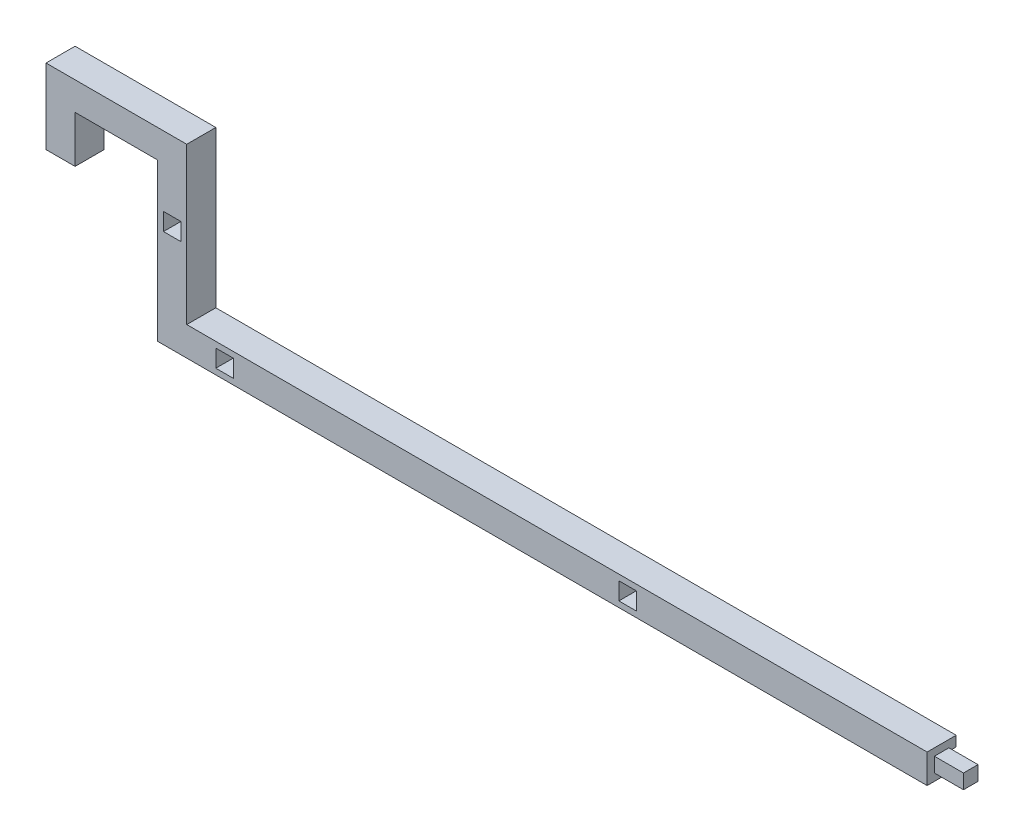
ISO-10303-21;
HEADER;
FILE_DESCRIPTION(('STEP AP214'),'2;1');
FILE_NAME('part.step','',(''),(''),'','','');
FILE_SCHEMA(('AUTOMOTIVE_DESIGN { 1 0 10303 214 1 1 1 1 }'));
ENDSEC;
DATA;
#1=APPLICATION_CONTEXT('core data for automotive mechanical design processes');
#2=APPLICATION_PROTOCOL_DEFINITION('international standard','automotive_design',2000,#1);
#3=PRODUCT_CONTEXT('',#1,'mechanical');
#4=PRODUCT('Part','Part','',(#3));
#5=PRODUCT_RELATED_PRODUCT_CATEGORY('part','',(#4));
#6=PRODUCT_DEFINITION_FORMATION('','',#4);
#7=PRODUCT_DEFINITION_CONTEXT('part definition',#1,'design');
#8=PRODUCT_DEFINITION('design','',#6,#7);
#9=PRODUCT_DEFINITION_SHAPE('','',#8);
#10=(LENGTH_UNIT() NAMED_UNIT(*) SI_UNIT(.MILLI.,.METRE.));
#11=(NAMED_UNIT(*) PLANE_ANGLE_UNIT() SI_UNIT($,.RADIAN.));
#12=(NAMED_UNIT(*) SI_UNIT($,.STERADIAN.) SOLID_ANGLE_UNIT());
#13=UNCERTAINTY_MEASURE_WITH_UNIT(LENGTH_MEASURE(1.E-05),#10,'distance_accuracy_value','');
#14=(GEOMETRIC_REPRESENTATION_CONTEXT(3) GLOBAL_UNCERTAINTY_ASSIGNED_CONTEXT((#13)) GLOBAL_UNIT_ASSIGNED_CONTEXT((#10,
#11,#12)) REPRESENTATION_CONTEXT('',''));
#15=CARTESIAN_POINT('',(0.,0.,0.));
#16=DIRECTION('',(0.,0.,1.));
#17=DIRECTION('',(1.,0.,0.));
#18=AXIS2_PLACEMENT_3D('',#15,#16,#17);
#19=CARTESIAN_POINT('',(0.,0.,0.));
#20=DIRECTION('',(0.,0.,-1.));
#21=DIRECTION('',(-1.,0.,0.));
#22=AXIS2_PLACEMENT_3D('',#19,#20,#21);
#23=PLANE('',#22);
#24=DIRECTION('',(-1.,0.,0.));
#25=VECTOR('',#24,1.);
#26=CARTESIAN_POINT('',(14.2,-17.2,0.));
#27=LINE('',#26,#25);
#28=CARTESIAN_POINT('',(146.5,-17.2,0.));
#29=VERTEX_POINT('',#28);
#30=CARTESIAN_POINT('',(96.4999999999999,-17.2,0.));
#31=VERTEX_POINT('',#30);
#32=EDGE_CURVE('E304',#29,#31,#27,.T.);
#33=ORIENTED_EDGE('',*,*,#32,.F.);
#34=DIRECTION('',(0.,1.,0.));
#35=VECTOR('',#34,1.);
#36=CARTESIAN_POINT('',(146.5,-18.95,0.));
#37=LINE('',#36,#35);
#38=CARTESIAN_POINT('',(146.5,-18.95,0.));
#39=VERTEX_POINT('',#38);
#40=EDGE_CURVE('E503',#39,#29,#37,.T.);
#41=ORIENTED_EDGE('',*,*,#40,.F.);
#42=DIRECTION('',(1.,0.,0.));
#43=VECTOR('',#42,1.);
#44=CARTESIAN_POINT('',(14.2,-18.95,0.));
#45=LINE('',#44,#43);
#46=CARTESIAN_POINT('',(14.2,-18.95,0.));
#47=VERTEX_POINT('',#46);
#48=EDGE_CURVE('E500',#47,#39,#45,.T.);
#49=ORIENTED_EDGE('',*,*,#48,.F.);
#50=DIRECTION('',(0.,-1.,0.));
#51=VECTOR('',#50,1.);
#52=CARTESIAN_POINT('',(14.2,8.05,0.));
#53=LINE('',#52,#51);
#54=CARTESIAN_POINT('',(14.2,-17.2,0.));
#55=VERTEX_POINT('',#54);
#56=EDGE_CURVE('E498',#55,#47,#53,.T.);
#57=ORIENTED_EDGE('',*,*,#56,.F.);
#58=CARTESIAN_POINT('',(24.2,-17.2,0.));
#59=VERTEX_POINT('',#58);
#60=EDGE_CURVE('E589',#59,#55,#27,.T.);
#61=ORIENTED_EDGE('',*,*,#60,.F.);
#62=DIRECTION('',(0.,1.,0.));
#63=VECTOR('',#62,1.);
#64=CARTESIAN_POINT('',(24.2,-14.95,0.));
#65=LINE('',#64,#63);
#66=CARTESIAN_POINT('',(24.2,-17.95,0.));
#67=VERTEX_POINT('',#66);
#68=EDGE_CURVE('E353',#67,#59,#65,.T.);
#69=ORIENTED_EDGE('',*,*,#68,.F.);
#70=DIRECTION('',(-1.,0.,0.));
#71=VECTOR('',#70,1.);
#72=CARTESIAN_POINT('',(27.2,-17.95,0.));
#73=LINE('',#72,#71);
#74=CARTESIAN_POINT('',(27.2,-17.95,0.));
#75=VERTEX_POINT('',#74);
#76=EDGE_CURVE('E348',#75,#67,#73,.T.);
#77=ORIENTED_EDGE('',*,*,#76,.F.);
#78=DIRECTION('',(0.,-1.,0.));
#79=VECTOR('',#78,1.);
#80=CARTESIAN_POINT('',(27.2,-14.95,0.));
#81=LINE('',#80,#79);
#82=CARTESIAN_POINT('',(27.2,-17.2,0.));
#83=VERTEX_POINT('',#82);
#84=EDGE_CURVE('E349',#83,#75,#81,.T.);
#85=ORIENTED_EDGE('',*,*,#84,.F.);
#86=CARTESIAN_POINT('',(93.4999999999999,-17.2,0.));
#87=VERTEX_POINT('',#86);
#88=EDGE_CURVE('E585',#87,#83,#27,.T.);
#89=ORIENTED_EDGE('',*,*,#88,.F.);
#90=DIRECTION('',(0.,1.,0.));
#91=VECTOR('',#90,1.);
#92=CARTESIAN_POINT('',(93.5,-14.95,0.));
#93=LINE('',#92,#91);
#94=CARTESIAN_POINT('',(93.5,-17.95,0.));
#95=VERTEX_POINT('',#94);
#96=EDGE_CURVE('E377',#95,#87,#93,.T.);
#97=ORIENTED_EDGE('',*,*,#96,.F.);
#98=DIRECTION('',(-1.,0.,0.));
#99=VECTOR('',#98,1.);
#100=CARTESIAN_POINT('',(96.5,-17.95,0.));
#101=LINE('',#100,#99);
#102=CARTESIAN_POINT('',(96.5,-17.95,0.));
#103=VERTEX_POINT('',#102);
#104=EDGE_CURVE('E373',#103,#95,#101,.T.);
#105=ORIENTED_EDGE('',*,*,#104,.F.);
#106=DIRECTION('',(0.,-1.,0.));
#107=VECTOR('',#106,1.);
#108=CARTESIAN_POINT('',(96.5,-14.95,0.));
#109=LINE('',#108,#107);
#110=EDGE_CURVE('E344',#31,#103,#109,.T.);
#111=ORIENTED_EDGE('',*,*,#110,.F.);
#112=EDGE_LOOP('',(#33,#41,#49,#57,#61,#69,#77,#85,#89,#97,#105,#111));
#113=FACE_BOUND('',#112,.T.);
#114=ADVANCED_FACE('F32',(#113),#23,.T.);
#115=CARTESIAN_POINT('',(146.5,-18.95,5.));
#116=DIRECTION('',(-1.,0.,0.));
#117=DIRECTION('',(0.,0.,1.));
#118=AXIS2_PLACEMENT_3D('',#115,#116,#117);
#119=PLANE('',#118);
#120=ORIENTED_EDGE('',*,*,#40,.T.);
#121=DIRECTION('',(0.,0.,-1.));
#122=VECTOR('',#121,1.);
#123=CARTESIAN_POINT('',(146.5,-17.2,2.));
#124=LINE('',#123,#122);
#125=CARTESIAN_POINT('',(146.5,-17.2,1.25));
#126=VERTEX_POINT('',#125);
#127=EDGE_CURVE('E600',#126,#29,#124,.T.);
#128=ORIENTED_EDGE('',*,*,#127,.F.);
#129=DIRECTION('',(0.,1.,0.));
#130=VECTOR('',#129,1.);
#131=CARTESIAN_POINT('',(146.5,-17.7,1.25));
#132=LINE('',#131,#130);
#133=CARTESIAN_POINT('',(146.5,-17.7,1.25));
#134=VERTEX_POINT('',#133);
#135=EDGE_CURVE('E454',#134,#126,#132,.T.);
#136=ORIENTED_EDGE('',*,*,#135,.F.);
#137=DIRECTION('',(0.,0.,-1.));
#138=VECTOR('',#137,1.);
#139=CARTESIAN_POINT('',(146.5,-17.7,3.75));
#140=LINE('',#139,#138);
#141=CARTESIAN_POINT('',(146.5,-17.7,3.75));
#142=VERTEX_POINT('',#141);
#143=EDGE_CURVE('E450',#142,#134,#140,.T.);
#144=ORIENTED_EDGE('',*,*,#143,.F.);
#145=DIRECTION('',(0.,-1.,0.));
#146=VECTOR('',#145,1.);
#147=CARTESIAN_POINT('',(146.5,-17.7,3.75));
#148=LINE('',#147,#146);
#149=CARTESIAN_POINT('',(146.5,-15.2,3.75));
#150=VERTEX_POINT('',#149);
#151=EDGE_CURVE('E430',#150,#142,#148,.T.);
#152=ORIENTED_EDGE('',*,*,#151,.F.);
#153=DIRECTION('',(0.,0.,1.));
#154=VECTOR('',#153,1.);
#155=CARTESIAN_POINT('',(146.5,-15.2,3.75));
#156=LINE('',#155,#154);
#157=CARTESIAN_POINT('',(146.5,-15.2,1.25));
#158=VERTEX_POINT('',#157);
#159=EDGE_CURVE('E441',#158,#150,#156,.T.);
#160=ORIENTED_EDGE('',*,*,#159,.F.);
#161=CARTESIAN_POINT('',(146.5,-15.7,1.25));
#162=VERTEX_POINT('',#161);
#163=EDGE_CURVE('E453',#162,#158,#132,.T.);
#164=ORIENTED_EDGE('',*,*,#163,.F.);
#165=DIRECTION('',(0.,0.,-1.));
#166=VECTOR('',#165,1.);
#167=CARTESIAN_POINT('',(146.5,-15.7,2.));
#168=LINE('',#167,#166);
#169=CARTESIAN_POINT('',(146.5,-15.7,0.));
#170=VERTEX_POINT('',#169);
#171=EDGE_CURVE('E311',#162,#170,#168,.T.);
#172=ORIENTED_EDGE('',*,*,#171,.T.);
#173=CARTESIAN_POINT('',(146.5,-13.95,0.));
#174=VERTEX_POINT('',#173);
#175=EDGE_CURVE('E502',#170,#174,#37,.T.);
#176=ORIENTED_EDGE('',*,*,#175,.T.);
#177=DIRECTION('',(0.,0.,-1.));
#178=VECTOR('',#177,1.);
#179=CARTESIAN_POINT('',(146.5,-13.95,5.));
#180=LINE('',#179,#178);
#181=CARTESIAN_POINT('',(146.5,-13.95,5.));
#182=VERTEX_POINT('',#181);
#183=EDGE_CURVE('E531',#182,#174,#180,.T.);
#184=ORIENTED_EDGE('',*,*,#183,.F.);
#185=DIRECTION('',(0.,1.,0.));
#186=VECTOR('',#185,1.);
#187=CARTESIAN_POINT('',(146.5,-18.95,5.));
#188=LINE('',#187,#186);
#189=CARTESIAN_POINT('',(146.5,-18.95,5.));
#190=VERTEX_POINT('',#189);
#191=EDGE_CURVE('E481',#190,#182,#188,.T.);
#192=ORIENTED_EDGE('',*,*,#191,.F.);
#193=DIRECTION('',(0.,0.,-1.));
#194=VECTOR('',#193,1.);
#195=CARTESIAN_POINT('',(146.5,-18.95,5.));
#196=LINE('',#195,#194);
#197=EDGE_CURVE('E534',#190,#39,#196,.T.);
#198=ORIENTED_EDGE('',*,*,#197,.T.);
#199=EDGE_LOOP('',(#120,#128,#136,#144,#152,#160,#164,#172,#176,#184,#192,#198));
#200=FACE_BOUND('',#199,.T.);
#201=ADVANCED_FACE('F614',(#200),#119,.F.);
#202=CARTESIAN_POINT('',(0.,6.7,5.));
#203=DIRECTION('',(-1.,0.,0.));
#204=DIRECTION('',(0.,0.,1.));
#205=AXIS2_PLACEMENT_3D('',#202,#203,#204);
#206=PLANE('',#205);
#207=DIRECTION('',(0.,1.,0.));
#208=VECTOR('',#207,1.);
#209=CARTESIAN_POINT('',(0.,6.7,0.));
#210=LINE('',#209,#208);
#211=CARTESIAN_POINT('',(0.,0.,0.));
#212=VERTEX_POINT('',#211);
#213=CARTESIAN_POINT('',(0.,8.05,0.));
#214=VERTEX_POINT('',#213);
#215=EDGE_CURVE('E471',#212,#214,#210,.T.);
#216=ORIENTED_EDGE('',*,*,#215,.T.);
#217=DIRECTION('',(0.,0.,-1.));
#218=VECTOR('',#217,1.);
#219=CARTESIAN_POINT('',(0.,8.05,5.));
#220=LINE('',#219,#218);
#221=CARTESIAN_POINT('',(0.,8.05,5.));
#222=VERTEX_POINT('',#221);
#223=EDGE_CURVE('E542',#222,#214,#220,.T.);
#224=ORIENTED_EDGE('',*,*,#223,.F.);
#225=DIRECTION('',(0.,1.,0.));
#226=VECTOR('',#225,1.);
#227=CARTESIAN_POINT('',(0.,6.7,5.));
#228=LINE('',#227,#226);
#229=CARTESIAN_POINT('',(0.,0.,5.));
#230=VERTEX_POINT('',#229);
#231=EDGE_CURVE('E472',#230,#222,#228,.T.);
#232=ORIENTED_EDGE('',*,*,#231,.F.);
#233=DIRECTION('',(0.,0.,-1.));
#234=VECTOR('',#233,1.);
#235=CARTESIAN_POINT('',(0.,0.,5.));
#236=LINE('',#235,#234);
#237=EDGE_CURVE('E493',#230,#212,#236,.T.);
#238=ORIENTED_EDGE('',*,*,#237,.T.);
#239=EDGE_LOOP('',(#216,#224,#232,#238));
#240=FACE_BOUND('',#239,.T.);
#241=ADVANCED_FACE('F34',(#240),#206,.F.);
#242=CARTESIAN_POINT('',(5.5,8.05,5.));
#243=DIRECTION('',(0.,1.,0.));
#244=DIRECTION('',(0.,0.,1.));
#245=AXIS2_PLACEMENT_3D('',#242,#243,#244);
#246=PLANE('',#245);
#247=DIRECTION('',(1.,0.,0.));
#248=VECTOR('',#247,1.);
#249=CARTESIAN_POINT('',(5.5,8.05,0.));
#250=LINE('',#249,#248);
#251=CARTESIAN_POINT('',(14.2,8.05,0.));
#252=VERTEX_POINT('',#251);
#253=EDGE_CURVE('E496',#214,#252,#250,.T.);
#254=ORIENTED_EDGE('',*,*,#253,.T.);
#255=DIRECTION('',(0.,0.,-1.));
#256=VECTOR('',#255,1.);
#257=CARTESIAN_POINT('',(14.2,8.05,5.));
#258=LINE('',#257,#256);
#259=CARTESIAN_POINT('',(14.2,8.05,5.));
#260=VERTEX_POINT('',#259);
#261=EDGE_CURVE('E540',#260,#252,#258,.T.);
#262=ORIENTED_EDGE('',*,*,#261,.F.);
#263=DIRECTION('',(1.,0.,0.));
#264=VECTOR('',#263,1.);
#265=CARTESIAN_POINT('',(0.,8.05,5.));
#266=LINE('',#265,#264);
#267=EDGE_CURVE('E474',#222,#260,#266,.T.);
#268=ORIENTED_EDGE('',*,*,#267,.F.);
#269=ORIENTED_EDGE('',*,*,#223,.T.);
#270=EDGE_LOOP('',(#254,#262,#268,#269));
#271=FACE_BOUND('',#270,.T.);
#272=ADVANCED_FACE('F949',(#271),#246,.F.);
#273=CARTESIAN_POINT('',(14.2,8.05,5.));
#274=DIRECTION('',(1.,0.,0.));
#275=DIRECTION('',(0.,1.,0.));
#276=AXIS2_PLACEMENT_3D('',#273,#274,#275);
#277=PLANE('',#276);
#278=DIRECTION('',(0.,1.,0.));
#279=VECTOR('',#278,1.);
#280=CARTESIAN_POINT('',(14.2,-17.2,2.));
#281=LINE('',#280,#279);
#282=CARTESIAN_POINT('',(14.2,-17.2,2.));
#283=VERTEX_POINT('',#282);
#284=CARTESIAN_POINT('',(14.2,-15.7,2.));
#285=VERTEX_POINT('',#284);
#286=EDGE_CURVE('E297',#283,#285,#281,.T.);
#287=ORIENTED_EDGE('',*,*,#286,.F.);
#288=DIRECTION('',(0.,0.,-1.));
#289=VECTOR('',#288,1.);
#290=CARTESIAN_POINT('',(14.2,-17.2,2.));
#291=LINE('',#290,#289);
#292=EDGE_CURVE('E322',#283,#55,#291,.T.);
#293=ORIENTED_EDGE('',*,*,#292,.T.);
#294=ORIENTED_EDGE('',*,*,#56,.T.);
#295=DIRECTION('',(0.,0.,-1.));
#296=VECTOR('',#295,1.);
#297=CARTESIAN_POINT('',(14.2,-18.95,5.));
#298=LINE('',#297,#296);
#299=CARTESIAN_POINT('',(14.2,-18.95,5.));
#300=VERTEX_POINT('',#299);
#301=EDGE_CURVE('E537',#300,#47,#298,.T.);
#302=ORIENTED_EDGE('',*,*,#301,.F.);
#303=DIRECTION('',(0.,-1.,0.));
#304=VECTOR('',#303,1.);
#305=CARTESIAN_POINT('',(14.2,8.05,5.));
#306=LINE('',#305,#304);
#307=EDGE_CURVE('E477',#260,#300,#306,.T.);
#308=ORIENTED_EDGE('',*,*,#307,.F.);
#309=ORIENTED_EDGE('',*,*,#261,.T.);
#310=CARTESIAN_POINT('',(14.2,-15.7,0.));
#311=VERTEX_POINT('',#310);
#312=EDGE_CURVE('E310',#252,#311,#53,.T.);
#313=ORIENTED_EDGE('',*,*,#312,.T.);
#314=DIRECTION('',(0.,0.,-1.));
#315=VECTOR('',#314,1.);
#316=CARTESIAN_POINT('',(14.2,-15.7,2.));
#317=LINE('',#316,#315);
#318=EDGE_CURVE('E287',#285,#311,#317,.T.);
#319=ORIENTED_EDGE('',*,*,#318,.F.);
#320=EDGE_LOOP('',(#287,#293,#294,#302,#308,#309,#313,#319));
#321=FACE_BOUND('',#320,.T.);
#322=ADVANCED_FACE('F307',(#321),#277,.F.);
#323=CARTESIAN_POINT('',(14.2,-18.95,5.));
#324=DIRECTION('',(0.,1.,0.));
#325=DIRECTION('',(-1.,0.,0.));
#326=AXIS2_PLACEMENT_3D('',#323,#324,#325);
#327=PLANE('',#326);
#328=ORIENTED_EDGE('',*,*,#48,.T.);
#329=ORIENTED_EDGE('',*,*,#197,.F.);
#330=DIRECTION('',(1.,0.,0.));
#331=VECTOR('',#330,1.);
#332=CARTESIAN_POINT('',(14.2,-18.95,5.));
#333=LINE('',#332,#331);
#334=EDGE_CURVE('E479',#300,#190,#333,.T.);
#335=ORIENTED_EDGE('',*,*,#334,.F.);
#336=ORIENTED_EDGE('',*,*,#301,.T.);
#337=EDGE_LOOP('',(#328,#329,#335,#336));
#338=FACE_BOUND('',#337,.T.);
#339=ADVANCED_FACE('F932',(#338),#327,.F.);
#340=CARTESIAN_POINT('',(19.2,-13.95,5.));
#341=DIRECTION('',(0.,-1.,0.));
#342=DIRECTION('',(0.,0.,-1.));
#343=AXIS2_PLACEMENT_3D('',#340,#341,#342);
#344=PLANE('',#343);
#345=DIRECTION('',(-1.,0.,0.));
#346=VECTOR('',#345,1.);
#347=CARTESIAN_POINT('',(19.2,-13.95,0.));
#348=LINE('',#347,#346);
#349=CARTESIAN_POINT('',(19.2,-13.95,0.));
#350=VERTEX_POINT('',#349);
#351=EDGE_CURVE('E506',#174,#350,#348,.T.);
#352=ORIENTED_EDGE('',*,*,#351,.T.);
#353=DIRECTION('',(0.,0.,-1.));
#354=VECTOR('',#353,1.);
#355=CARTESIAN_POINT('',(19.2,-13.95,5.));
#356=LINE('',#355,#354);
#357=CARTESIAN_POINT('',(19.2,-13.95,5.));
#358=VERTEX_POINT('',#357);
#359=EDGE_CURVE('E528',#358,#350,#356,.T.);
#360=ORIENTED_EDGE('',*,*,#359,.F.);
#361=DIRECTION('',(-1.,0.,0.));
#362=VECTOR('',#361,1.);
#363=CARTESIAN_POINT('',(19.2,-13.95,5.));
#364=LINE('',#363,#362);
#365=EDGE_CURVE('E483',#182,#358,#364,.T.);
#366=ORIENTED_EDGE('',*,*,#365,.F.);
#367=ORIENTED_EDGE('',*,*,#183,.T.);
#368=EDGE_LOOP('',(#352,#360,#366,#367));
#369=FACE_BOUND('',#368,.T.);
#370=ADVANCED_FACE('F922',(#369),#344,.F.);
#371=CARTESIAN_POINT('',(19.2,12.9,5.));
#372=DIRECTION('',(-1.,0.,0.));
#373=DIRECTION('',(0.,-1.,0.));
#374=AXIS2_PLACEMENT_3D('',#371,#372,#373);
#375=PLANE('',#374);
#376=DIRECTION('',(0.,1.,0.));
#377=VECTOR('',#376,1.);
#378=CARTESIAN_POINT('',(19.2,12.9,0.));
#379=LINE('',#378,#377);
#380=CARTESIAN_POINT('',(19.2,12.9,0.));
#381=VERTEX_POINT('',#380);
#382=EDGE_CURVE('E508',#350,#381,#379,.T.);
#383=ORIENTED_EDGE('',*,*,#382,.T.);
#384=DIRECTION('',(0.,0.,-1.));
#385=VECTOR('',#384,1.);
#386=CARTESIAN_POINT('',(19.2,12.9,5.));
#387=LINE('',#386,#385);
#388=CARTESIAN_POINT('',(19.2,12.9,5.));
#389=VERTEX_POINT('',#388);
#390=EDGE_CURVE('E525',#389,#381,#387,.T.);
#391=ORIENTED_EDGE('',*,*,#390,.F.);
#392=DIRECTION('',(0.,1.,0.));
#393=VECTOR('',#392,1.);
#394=CARTESIAN_POINT('',(19.2,12.9,5.));
#395=LINE('',#394,#393);
#396=EDGE_CURVE('E485',#358,#389,#395,.T.);
#397=ORIENTED_EDGE('',*,*,#396,.F.);
#398=ORIENTED_EDGE('',*,*,#359,.T.);
#399=EDGE_LOOP('',(#383,#391,#397,#398));
#400=FACE_BOUND('',#399,.T.);
#401=ADVANCED_FACE('F911',(#400),#375,.F.);
#402=CARTESIAN_POINT('',(-5.,12.9,5.));
#403=DIRECTION('',(0.,-1.,0.));
#404=DIRECTION('',(0.,0.,-1.));
#405=AXIS2_PLACEMENT_3D('',#402,#403,#404);
#406=PLANE('',#405);
#407=DIRECTION('',(-1.,0.,0.));
#408=VECTOR('',#407,1.);
#409=CARTESIAN_POINT('',(-5.,12.9,0.));
#410=LINE('',#409,#408);
#411=CARTESIAN_POINT('',(-5.,12.9,0.));
#412=VERTEX_POINT('',#411);
#413=EDGE_CURVE('E511',#381,#412,#410,.T.);
#414=ORIENTED_EDGE('',*,*,#413,.T.);
#415=DIRECTION('',(0.,0.,-1.));
#416=VECTOR('',#415,1.);
#417=CARTESIAN_POINT('',(-5.,12.9,5.));
#418=LINE('',#417,#416);
#419=CARTESIAN_POINT('',(-5.,12.9,5.));
#420=VERTEX_POINT('',#419);
#421=EDGE_CURVE('E522',#420,#412,#418,.T.);
#422=ORIENTED_EDGE('',*,*,#421,.F.);
#423=DIRECTION('',(-1.,0.,0.));
#424=VECTOR('',#423,1.);
#425=CARTESIAN_POINT('',(5.5,12.9,5.));
#426=LINE('',#425,#424);
#427=EDGE_CURVE('E487',#389,#420,#426,.T.);
#428=ORIENTED_EDGE('',*,*,#427,.F.);
#429=ORIENTED_EDGE('',*,*,#390,.T.);
#430=EDGE_LOOP('',(#414,#422,#428,#429));
#431=FACE_BOUND('',#430,.T.);
#432=ADVANCED_FACE('F901',(#431),#406,.F.);
#433=CARTESIAN_POINT('',(-5.,0.,5.));
#434=DIRECTION('',(1.,0.,0.));
#435=DIRECTION('',(0.,0.,-1.));
#436=AXIS2_PLACEMENT_3D('',#433,#434,#435);
#437=PLANE('',#436);
#438=DIRECTION('',(0.,-1.,0.));
#439=VECTOR('',#438,1.);
#440=CARTESIAN_POINT('',(-5.,0.,0.));
#441=LINE('',#440,#439);
#442=CARTESIAN_POINT('',(-5.,0.,0.));
#443=VERTEX_POINT('',#442);
#444=EDGE_CURVE('E513',#412,#443,#441,.T.);
#445=ORIENTED_EDGE('',*,*,#444,.T.);
#446=DIRECTION('',(0.,0.,-1.));
#447=VECTOR('',#446,1.);
#448=CARTESIAN_POINT('',(-5.,0.,5.));
#449=LINE('',#448,#447);
#450=CARTESIAN_POINT('',(-5.,0.,5.));
#451=VERTEX_POINT('',#450);
#452=EDGE_CURVE('E519',#451,#443,#449,.T.);
#453=ORIENTED_EDGE('',*,*,#452,.F.);
#454=DIRECTION('',(0.,-1.,0.));
#455=VECTOR('',#454,1.);
#456=CARTESIAN_POINT('',(-5.,0.,5.));
#457=LINE('',#456,#455);
#458=EDGE_CURVE('E489',#420,#451,#457,.T.);
#459=ORIENTED_EDGE('',*,*,#458,.F.);
#460=ORIENTED_EDGE('',*,*,#421,.T.);
#461=EDGE_LOOP('',(#445,#453,#459,#460));
#462=FACE_BOUND('',#461,.T.);
#463=ADVANCED_FACE('F667',(#462),#437,.F.);
#464=CARTESIAN_POINT('',(0.,0.,5.));
#465=DIRECTION('',(0.,1.,0.));
#466=DIRECTION('',(-1.,0.,0.));
#467=AXIS2_PLACEMENT_3D('',#464,#465,#466);
#468=PLANE('',#467);
#469=DIRECTION('',(1.,0.,0.));
#470=VECTOR('',#469,1.);
#471=CARTESIAN_POINT('',(0.,0.,0.));
#472=LINE('',#471,#470);
#473=EDGE_CURVE('E475',#443,#212,#472,.T.);
#474=ORIENTED_EDGE('',*,*,#473,.T.);
#475=ORIENTED_EDGE('',*,*,#237,.F.);
#476=DIRECTION('',(1.,0.,0.));
#477=VECTOR('',#476,1.);
#478=CARTESIAN_POINT('',(0.,0.,5.));
#479=LINE('',#478,#477);
#480=EDGE_CURVE('E491',#451,#230,#479,.T.);
#481=ORIENTED_EDGE('',*,*,#480,.F.);
#482=ORIENTED_EDGE('',*,*,#452,.T.);
#483=EDGE_LOOP('',(#474,#475,#481,#482));
#484=FACE_BOUND('',#483,.T.);
#485=ADVANCED_FACE('F661',(#484),#468,.F.);
#486=CARTESIAN_POINT('',(0.,0.,5.));
#487=DIRECTION('',(0.,0.,-1.));
#488=DIRECTION('',(-1.,0.,0.));
#489=AXIS2_PLACEMENT_3D('',#486,#487,#488);
#490=PLANE('',#489);
#491=DIRECTION('',(1.,0.,0.));
#492=VECTOR('',#491,1.);
#493=CARTESIAN_POINT('',(0.,-14.95,5.));
#494=LINE('',#493,#492);
#495=CARTESIAN_POINT('',(24.2,-14.95,5.));
#496=VERTEX_POINT('',#495);
#497=CARTESIAN_POINT('',(27.2,-14.95,5.));
#498=VERTEX_POINT('',#497);
#499=EDGE_CURVE('E410',#496,#498,#494,.T.);
#500=ORIENTED_EDGE('',*,*,#499,.T.);
#501=DIRECTION('',(0.,-1.,0.));
#502=VECTOR('',#501,1.);
#503=CARTESIAN_POINT('',(27.2,0.,5.));
#504=LINE('',#503,#502);
#505=CARTESIAN_POINT('',(27.2,-17.95,5.));
#506=VERTEX_POINT('',#505);
#507=EDGE_CURVE('E413',#498,#506,#504,.T.);
#508=ORIENTED_EDGE('',*,*,#507,.T.);
#509=DIRECTION('',(-1.,0.,0.));
#510=VECTOR('',#509,1.);
#511=CARTESIAN_POINT('',(0.,-17.95,5.));
#512=LINE('',#511,#510);
#513=CARTESIAN_POINT('',(24.2,-17.95,5.));
#514=VERTEX_POINT('',#513);
#515=EDGE_CURVE('E404',#506,#514,#512,.T.);
#516=ORIENTED_EDGE('',*,*,#515,.T.);
#517=DIRECTION('',(0.,1.,0.));
#518=VECTOR('',#517,1.);
#519=CARTESIAN_POINT('',(24.2,0.,5.));
#520=LINE('',#519,#518);
#521=EDGE_CURVE('E407',#514,#496,#520,.T.);
#522=ORIENTED_EDGE('',*,*,#521,.T.);
#523=EDGE_LOOP('',(#500,#508,#516,#522));
#524=FACE_BOUND('',#523,.T.);
#525=DIRECTION('',(1.,0.,0.));
#526=VECTOR('',#525,1.);
#527=CARTESIAN_POINT('',(0.,-14.95,5.));
#528=LINE('',#527,#526);
#529=CARTESIAN_POINT('',(93.5,-14.95,5.));
#530=VERTEX_POINT('',#529);
#531=CARTESIAN_POINT('',(96.5,-14.95,5.));
#532=VERTEX_POINT('',#531);
#533=EDGE_CURVE('E398',#530,#532,#528,.T.);
#534=ORIENTED_EDGE('',*,*,#533,.T.);
#535=DIRECTION('',(0.,-1.,0.));
#536=VECTOR('',#535,1.);
#537=CARTESIAN_POINT('',(96.5,0.,5.));
#538=LINE('',#537,#536);
#539=CARTESIAN_POINT('',(96.5,-17.95,5.));
#540=VERTEX_POINT('',#539);
#541=EDGE_CURVE('E401',#532,#540,#538,.T.);
#542=ORIENTED_EDGE('',*,*,#541,.T.);
#543=DIRECTION('',(-1.,0.,0.));
#544=VECTOR('',#543,1.);
#545=CARTESIAN_POINT('',(0.,-17.95,5.));
#546=LINE('',#545,#544);
#547=CARTESIAN_POINT('',(93.5,-17.95,5.));
#548=VERTEX_POINT('',#547);
#549=EDGE_CURVE('E362',#540,#548,#546,.T.);
#550=ORIENTED_EDGE('',*,*,#549,.T.);
#551=DIRECTION('',(0.,1.,0.));
#552=VECTOR('',#551,1.);
#553=CARTESIAN_POINT('',(93.5,0.,5.));
#554=LINE('',#553,#552);
#555=EDGE_CURVE('E395',#548,#530,#554,.T.);
#556=ORIENTED_EDGE('',*,*,#555,.T.);
#557=EDGE_LOOP('',(#534,#542,#550,#556));
#558=FACE_BOUND('',#557,.T.);
#559=DIRECTION('',(1.,0.,0.));
#560=VECTOR('',#559,1.);
#561=CARTESIAN_POINT('',(15.2,-2.1,5.));
#562=LINE('',#561,#560);
#563=CARTESIAN_POINT('',(15.2,-2.1,5.));
#564=VERTEX_POINT('',#563);
#565=CARTESIAN_POINT('',(18.2,-2.1,5.));
#566=VERTEX_POINT('',#565);
#567=EDGE_CURVE('E418',#564,#566,#562,.T.);
#568=ORIENTED_EDGE('',*,*,#567,.F.);
#569=DIRECTION('',(0.,-1.,0.));
#570=VECTOR('',#569,1.);
#571=CARTESIAN_POINT('',(15.2,0.9,5.));
#572=LINE('',#571,#570);
#573=CARTESIAN_POINT('',(15.2,0.9,5.));
#574=VERTEX_POINT('',#573);
#575=EDGE_CURVE('E416',#574,#564,#572,.T.);
#576=ORIENTED_EDGE('',*,*,#575,.F.);
#577=DIRECTION('',(-1.,0.,0.));
#578=VECTOR('',#577,1.);
#579=CARTESIAN_POINT('',(15.2,0.9,5.));
#580=LINE('',#579,#578);
#581=CARTESIAN_POINT('',(18.2,0.9,5.));
#582=VERTEX_POINT('',#581);
#583=EDGE_CURVE('E424',#582,#574,#580,.T.);
#584=ORIENTED_EDGE('',*,*,#583,.F.);
#585=DIRECTION('',(0.,1.,0.));
#586=VECTOR('',#585,1.);
#587=CARTESIAN_POINT('',(18.2,0.9,5.));
#588=LINE('',#587,#586);
#589=EDGE_CURVE('E421',#566,#582,#588,.T.);
#590=ORIENTED_EDGE('',*,*,#589,.F.);
#591=EDGE_LOOP('',(#568,#576,#584,#590));
#592=FACE_BOUND('',#591,.T.);
#593=ORIENTED_EDGE('',*,*,#231,.T.);
#594=ORIENTED_EDGE('',*,*,#267,.T.);
#595=ORIENTED_EDGE('',*,*,#307,.T.);
#596=ORIENTED_EDGE('',*,*,#334,.T.);
#597=ORIENTED_EDGE('',*,*,#191,.T.);
#598=ORIENTED_EDGE('',*,*,#365,.T.);
#599=ORIENTED_EDGE('',*,*,#396,.T.);
#600=ORIENTED_EDGE('',*,*,#427,.T.);
#601=ORIENTED_EDGE('',*,*,#458,.T.);
#602=ORIENTED_EDGE('',*,*,#480,.T.);
#603=EDGE_LOOP('',(#593,#594,#595,#596,#597,#598,#599,#600,#601,#602));
#604=FACE_BOUND('',#603,.T.);
#605=ADVANCED_FACE('F571',(#524,#558,#592,#604),#490,.F.);
#606=DIRECTION('',(1.,0.,0.));
#607=VECTOR('',#606,1.);
#608=CARTESIAN_POINT('',(14.2,-15.7,0.));
#609=LINE('',#608,#607);
#610=CARTESIAN_POINT('',(24.2,-15.7,0.));
#611=VERTEX_POINT('',#610);
#612=EDGE_CURVE('E563',#311,#611,#609,.T.);
#613=ORIENTED_EDGE('',*,*,#612,.F.);
#614=ORIENTED_EDGE('',*,*,#312,.F.);
#615=ORIENTED_EDGE('',*,*,#253,.F.);
#616=ORIENTED_EDGE('',*,*,#215,.F.);
#617=ORIENTED_EDGE('',*,*,#473,.F.);
#618=ORIENTED_EDGE('',*,*,#444,.F.);
#619=ORIENTED_EDGE('',*,*,#413,.F.);
#620=ORIENTED_EDGE('',*,*,#382,.F.);
#621=ORIENTED_EDGE('',*,*,#351,.F.);
#622=ORIENTED_EDGE('',*,*,#175,.F.);
#623=CARTESIAN_POINT('',(96.4999999999999,-15.7,0.));
#624=VERTEX_POINT('',#623);
#625=EDGE_CURVE('E596',#624,#170,#609,.T.);
#626=ORIENTED_EDGE('',*,*,#625,.F.);
#627=CARTESIAN_POINT('',(96.5,-14.95,0.));
#628=VERTEX_POINT('',#627);
#629=EDGE_CURVE('E370',#628,#624,#109,.T.);
#630=ORIENTED_EDGE('',*,*,#629,.F.);
#631=DIRECTION('',(1.,0.,0.));
#632=VECTOR('',#631,1.);
#633=CARTESIAN_POINT('',(96.5,-14.95,0.));
#634=LINE('',#633,#632);
#635=CARTESIAN_POINT('',(93.5,-14.95,0.));
#636=VERTEX_POINT('',#635);
#637=EDGE_CURVE('E380',#636,#628,#634,.T.);
#638=ORIENTED_EDGE('',*,*,#637,.F.);
#639=CARTESIAN_POINT('',(93.4999999999999,-15.7,0.));
#640=VERTEX_POINT('',#639);
#641=EDGE_CURVE('E376',#640,#636,#93,.T.);
#642=ORIENTED_EDGE('',*,*,#641,.F.);
#643=CARTESIAN_POINT('',(27.2,-15.7,0.));
#644=VERTEX_POINT('',#643);
#645=EDGE_CURVE('E595',#644,#640,#609,.T.);
#646=ORIENTED_EDGE('',*,*,#645,.F.);
#647=CARTESIAN_POINT('',(27.2,-14.95,0.));
#648=VERTEX_POINT('',#647);
#649=EDGE_CURVE('E345',#648,#644,#81,.T.);
#650=ORIENTED_EDGE('',*,*,#649,.F.);
#651=DIRECTION('',(1.,0.,0.));
#652=VECTOR('',#651,1.);
#653=CARTESIAN_POINT('',(27.2,-14.95,0.));
#654=LINE('',#653,#652);
#655=CARTESIAN_POINT('',(24.2,-14.95,0.));
#656=VERTEX_POINT('',#655);
#657=EDGE_CURVE('E356',#656,#648,#654,.T.);
#658=ORIENTED_EDGE('',*,*,#657,.F.);
#659=EDGE_CURVE('E352',#611,#656,#65,.T.);
#660=ORIENTED_EDGE('',*,*,#659,.F.);
#661=EDGE_LOOP('',(#613,#614,#615,#616,#617,#618,#619,#620,#621,#622,#626,#630,#638,#642,#646,
#650,#658,#660));
#662=FACE_BOUND('',#661,.T.);
#663=DIRECTION('',(0.,1.,0.));
#664=VECTOR('',#663,1.);
#665=CARTESIAN_POINT('',(15.2,0.,0.));
#666=LINE('',#665,#664);
#667=CARTESIAN_POINT('',(15.2,-2.1,0.));
#668=VERTEX_POINT('',#667);
#669=CARTESIAN_POINT('',(15.2,0.9,0.));
#670=VERTEX_POINT('',#669);
#671=EDGE_CURVE('E552',#668,#670,#666,.T.);
#672=ORIENTED_EDGE('',*,*,#671,.F.);
#673=DIRECTION('',(-1.,0.,0.));
#674=VECTOR('',#673,1.);
#675=CARTESIAN_POINT('',(0.,-2.1,0.));
#676=LINE('',#675,#674);
#677=CARTESIAN_POINT('',(18.2,-2.1,0.));
#678=VERTEX_POINT('',#677);
#679=EDGE_CURVE('E545',#678,#668,#676,.T.);
#680=ORIENTED_EDGE('',*,*,#679,.F.);
#681=DIRECTION('',(0.,-1.,0.));
#682=VECTOR('',#681,1.);
#683=CARTESIAN_POINT('',(18.2,0.,0.));
#684=LINE('',#683,#682);
#685=CARTESIAN_POINT('',(18.2,0.9,0.));
#686=VERTEX_POINT('',#685);
#687=EDGE_CURVE('E547',#686,#678,#684,.T.);
#688=ORIENTED_EDGE('',*,*,#687,.F.);
#689=DIRECTION('',(1.,0.,0.));
#690=VECTOR('',#689,1.);
#691=CARTESIAN_POINT('',(0.,0.9,0.));
#692=LINE('',#691,#690);
#693=EDGE_CURVE('E550',#670,#686,#692,.T.);
#694=ORIENTED_EDGE('',*,*,#693,.F.);
#695=EDGE_LOOP('',(#672,#680,#688,#694));
#696=FACE_BOUND('',#695,.T.);
#697=ADVANCED_FACE('F561',(#662,#696),#23,.T.);
#698=CARTESIAN_POINT('',(151.5,-17.7,3.75));
#699=DIRECTION('',(0.,0.,-1.));
#700=DIRECTION('',(-1.,0.,0.));
#701=AXIS2_PLACEMENT_3D('',#698,#699,#700);
#702=PLANE('',#701);
#703=ORIENTED_EDGE('',*,*,#151,.T.);
#704=DIRECTION('',(-1.,0.,0.));
#705=VECTOR('',#704,1.);
#706=CARTESIAN_POINT('',(151.5,-17.7,3.75));
#707=LINE('',#706,#705);
#708=CARTESIAN_POINT('',(151.5,-17.7,3.75));
#709=VERTEX_POINT('',#708);
#710=EDGE_CURVE('E468',#709,#142,#707,.T.);
#711=ORIENTED_EDGE('',*,*,#710,.F.);
#712=DIRECTION('',(0.,-1.,0.));
#713=VECTOR('',#712,1.);
#714=CARTESIAN_POINT('',(151.5,-17.7,3.75));
#715=LINE('',#714,#713);
#716=CARTESIAN_POINT('',(151.5,-15.2,3.75));
#717=VERTEX_POINT('',#716);
#718=EDGE_CURVE('E437',#717,#709,#715,.T.);
#719=ORIENTED_EDGE('',*,*,#718,.F.);
#720=DIRECTION('',(-1.,0.,0.));
#721=VECTOR('',#720,1.);
#722=CARTESIAN_POINT('',(151.5,-15.2,3.75));
#723=LINE('',#722,#721);
#724=EDGE_CURVE('E447',#717,#150,#723,.T.);
#725=ORIENTED_EDGE('',*,*,#724,.T.);
#726=EDGE_LOOP('',(#703,#711,#719,#725));
#727=FACE_BOUND('',#726,.T.);
#728=ADVANCED_FACE('F626',(#727),#702,.F.);
#729=CARTESIAN_POINT('',(151.5,-17.7,3.75));
#730=DIRECTION('',(0.,1.,0.));
#731=DIRECTION('',(0.,0.,1.));
#732=AXIS2_PLACEMENT_3D('',#729,#730,#731);
#733=PLANE('',#732);
#734=ORIENTED_EDGE('',*,*,#143,.T.);
#735=DIRECTION('',(-1.,0.,0.));
#736=VECTOR('',#735,1.);
#737=CARTESIAN_POINT('',(151.5,-17.7,1.25));
#738=LINE('',#737,#736);
#739=CARTESIAN_POINT('',(151.5,-17.7,1.25));
#740=VERTEX_POINT('',#739);
#741=EDGE_CURVE('E465',#740,#134,#738,.T.);
#742=ORIENTED_EDGE('',*,*,#741,.F.);
#743=DIRECTION('',(0.,0.,-1.));
#744=VECTOR('',#743,1.);
#745=CARTESIAN_POINT('',(151.5,-17.7,3.75));
#746=LINE('',#745,#744);
#747=EDGE_CURVE('E440',#709,#740,#746,.T.);
#748=ORIENTED_EDGE('',*,*,#747,.F.);
#749=ORIENTED_EDGE('',*,*,#710,.T.);
#750=EDGE_LOOP('',(#734,#742,#748,#749));
#751=FACE_BOUND('',#750,.T.);
#752=ADVANCED_FACE('F622',(#751),#733,.F.);
#753=CARTESIAN_POINT('',(151.5,-17.7,1.25));
#754=DIRECTION('',(0.,0.,1.));
#755=DIRECTION('',(1.,0.,0.));
#756=AXIS2_PLACEMENT_3D('',#753,#754,#755);
#757=PLANE('',#756);
#758=ORIENTED_EDGE('',*,*,#135,.T.);
#759=EDGE_CURVE('E457',#126,#162,#132,.T.);
#760=ORIENTED_EDGE('',*,*,#759,.T.);
#761=ORIENTED_EDGE('',*,*,#163,.T.);
#762=DIRECTION('',(-1.,0.,0.));
#763=VECTOR('',#762,1.);
#764=CARTESIAN_POINT('',(151.5,-15.2,1.25));
#765=LINE('',#764,#763);
#766=CARTESIAN_POINT('',(151.5,-15.2,1.25));
#767=VERTEX_POINT('',#766);
#768=EDGE_CURVE('E462',#767,#158,#765,.T.);
#769=ORIENTED_EDGE('',*,*,#768,.F.);
#770=DIRECTION('',(0.,1.,0.));
#771=VECTOR('',#770,1.);
#772=CARTESIAN_POINT('',(151.5,-17.7,1.25));
#773=LINE('',#772,#771);
#774=EDGE_CURVE('E443',#740,#767,#773,.T.);
#775=ORIENTED_EDGE('',*,*,#774,.F.);
#776=ORIENTED_EDGE('',*,*,#741,.T.);
#777=EDGE_LOOP('',(#758,#760,#761,#769,#775,#776));
#778=FACE_BOUND('',#777,.T.);
#779=ADVANCED_FACE('F618',(#778),#757,.F.);
#780=CARTESIAN_POINT('',(151.5,-15.2,3.75));
#781=DIRECTION('',(0.,-1.,0.));
#782=DIRECTION('',(0.,0.,-1.));
#783=AXIS2_PLACEMENT_3D('',#780,#781,#782);
#784=PLANE('',#783);
#785=ORIENTED_EDGE('',*,*,#159,.T.);
#786=ORIENTED_EDGE('',*,*,#724,.F.);
#787=DIRECTION('',(0.,0.,1.));
#788=VECTOR('',#787,1.);
#789=CARTESIAN_POINT('',(151.5,-15.2,3.75));
#790=LINE('',#789,#788);
#791=EDGE_CURVE('E445',#767,#717,#790,.T.);
#792=ORIENTED_EDGE('',*,*,#791,.F.);
#793=ORIENTED_EDGE('',*,*,#768,.T.);
#794=EDGE_LOOP('',(#785,#786,#792,#793));
#795=FACE_BOUND('',#794,.T.);
#796=ADVANCED_FACE('F629',(#795),#784,.F.);
#797=CARTESIAN_POINT('',(151.5,0.,0.));
#798=DIRECTION('',(-1.,0.,0.));
#799=DIRECTION('',(0.,0.,1.));
#800=AXIS2_PLACEMENT_3D('',#797,#798,#799);
#801=PLANE('',#800);
#802=ORIENTED_EDGE('',*,*,#718,.T.);
#803=ORIENTED_EDGE('',*,*,#747,.T.);
#804=ORIENTED_EDGE('',*,*,#774,.T.);
#805=ORIENTED_EDGE('',*,*,#791,.T.);
#806=EDGE_LOOP('',(#802,#803,#804,#805));
#807=FACE_BOUND('',#806,.T.);
#808=ADVANCED_FACE('F632',(#807),#801,.F.);
#809=CARTESIAN_POINT('',(15.2,0.9,-5.));
#810=DIRECTION('',(-1.,0.,0.));
#811=DIRECTION('',(0.,0.,1.));
#812=AXIS2_PLACEMENT_3D('',#809,#810,#811);
#813=PLANE('',#812);
#814=ORIENTED_EDGE('',*,*,#671,.T.);
#815=DIRECTION('',(0.,0.,1.));
#816=VECTOR('',#815,1.);
#817=CARTESIAN_POINT('',(15.2,0.9,-5.));
#818=LINE('',#817,#816);
#819=EDGE_CURVE('E428',#670,#574,#818,.T.);
#820=ORIENTED_EDGE('',*,*,#819,.T.);
#821=ORIENTED_EDGE('',*,*,#575,.T.);
#822=DIRECTION('',(0.,0.,1.));
#823=VECTOR('',#822,1.);
#824=CARTESIAN_POINT('',(15.2,-2.1,-5.));
#825=LINE('',#824,#823);
#826=EDGE_CURVE('E427',#668,#564,#825,.T.);
#827=ORIENTED_EDGE('',*,*,#826,.F.);
#828=EDGE_LOOP('',(#814,#820,#821,#827));
#829=FACE_BOUND('',#828,.T.);
#830=ADVANCED_FACE('F634',(#829),#813,.F.);
#831=CARTESIAN_POINT('',(15.2,0.9,-5.));
#832=DIRECTION('',(0.,1.,0.));
#833=DIRECTION('',(0.,0.,1.));
#834=AXIS2_PLACEMENT_3D('',#831,#832,#833);
#835=PLANE('',#834);
#836=ORIENTED_EDGE('',*,*,#693,.T.);
#837=DIRECTION('',(0.,0.,1.));
#838=VECTOR('',#837,1.);
#839=CARTESIAN_POINT('',(18.2,0.9,-5.));
#840=LINE('',#839,#838);
#841=EDGE_CURVE('E431',#686,#582,#840,.T.);
#842=ORIENTED_EDGE('',*,*,#841,.T.);
#843=ORIENTED_EDGE('',*,*,#583,.T.);
#844=ORIENTED_EDGE('',*,*,#819,.F.);
#845=EDGE_LOOP('',(#836,#842,#843,#844));
#846=FACE_BOUND('',#845,.T.);
#847=ADVANCED_FACE('F640',(#846),#835,.F.);
#848=CARTESIAN_POINT('',(18.2,0.9,-5.));
#849=DIRECTION('',(1.,0.,0.));
#850=DIRECTION('',(0.,0.,-1.));
#851=AXIS2_PLACEMENT_3D('',#848,#849,#850);
#852=PLANE('',#851);
#853=ORIENTED_EDGE('',*,*,#687,.T.);
#854=DIRECTION('',(0.,0.,1.));
#855=VECTOR('',#854,1.);
#856=CARTESIAN_POINT('',(18.2,-2.1,-5.));
#857=LINE('',#856,#855);
#858=EDGE_CURVE('E433',#678,#566,#857,.T.);
#859=ORIENTED_EDGE('',*,*,#858,.T.);
#860=ORIENTED_EDGE('',*,*,#589,.T.);
#861=ORIENTED_EDGE('',*,*,#841,.F.);
#862=EDGE_LOOP('',(#853,#859,#860,#861));
#863=FACE_BOUND('',#862,.T.);
#864=ADVANCED_FACE('F703',(#863),#852,.F.);
#865=CARTESIAN_POINT('',(15.2,-2.1,-5.));
#866=DIRECTION('',(0.,-1.,0.));
#867=DIRECTION('',(0.,0.,-1.));
#868=AXIS2_PLACEMENT_3D('',#865,#866,#867);
#869=PLANE('',#868);
#870=ORIENTED_EDGE('',*,*,#679,.T.);
#871=ORIENTED_EDGE('',*,*,#826,.T.);
#872=ORIENTED_EDGE('',*,*,#567,.T.);
#873=ORIENTED_EDGE('',*,*,#858,.F.);
#874=EDGE_LOOP('',(#870,#871,#872,#873));
#875=FACE_BOUND('',#874,.T.);
#876=ADVANCED_FACE('F712',(#875),#869,.F.);
#877=CARTESIAN_POINT('',(96.5,-14.95,12.));
#878=DIRECTION('',(1.,0.,0.));
#879=DIRECTION('',(0.,0.,-1.));
#880=AXIS2_PLACEMENT_3D('',#877,#878,#879);
#881=PLANE('',#880);
#882=DIRECTION('',(0.,1.,0.));
#883=VECTOR('',#882,1.);
#884=CARTESIAN_POINT('',(96.5,-14.95,2.));
#885=LINE('',#884,#883);
#886=CARTESIAN_POINT('',(96.5,-17.2,2.));
#887=VERTEX_POINT('',#886);
#888=CARTESIAN_POINT('',(96.4999999999999,-15.7,2.));
#889=VERTEX_POINT('',#888);
#890=EDGE_CURVE('E324',#887,#889,#885,.T.);
#891=ORIENTED_EDGE('',*,*,#890,.F.);
#892=DIRECTION('',(0.,0.,-1.));
#893=VECTOR('',#892,1.);
#894=CARTESIAN_POINT('',(96.5,-17.2,12.));
#895=LINE('',#894,#893);
#896=EDGE_CURVE('E341',#887,#31,#895,.T.);
#897=ORIENTED_EDGE('',*,*,#896,.T.);
#898=ORIENTED_EDGE('',*,*,#110,.T.);
#899=DIRECTION('',(0.,0.,-1.));
#900=VECTOR('',#899,1.);
#901=CARTESIAN_POINT('',(96.5,-17.95,12.));
#902=LINE('',#901,#900);
#903=EDGE_CURVE('E383',#540,#103,#902,.T.);
#904=ORIENTED_EDGE('',*,*,#903,.F.);
#905=ORIENTED_EDGE('',*,*,#541,.F.);
#906=DIRECTION('',(0.,0.,-1.));
#907=VECTOR('',#906,1.);
#908=CARTESIAN_POINT('',(96.5,-14.95,12.));
#909=LINE('',#908,#907);
#910=EDGE_CURVE('E384',#532,#628,#909,.T.);
#911=ORIENTED_EDGE('',*,*,#910,.T.);
#912=ORIENTED_EDGE('',*,*,#629,.T.);
#913=DIRECTION('',(0.,0.,1.));
#914=VECTOR('',#913,1.);
#915=CARTESIAN_POINT('',(96.5,-15.7,12.));
#916=LINE('',#915,#914);
#917=EDGE_CURVE('E332',#624,#889,#916,.T.);
#918=ORIENTED_EDGE('',*,*,#917,.T.);
#919=EDGE_LOOP('',(#891,#897,#898,#904,#905,#911,#912,#918));
#920=FACE_BOUND('',#919,.T.);
#921=ADVANCED_FACE('F721',(#920),#881,.F.);
#922=CARTESIAN_POINT('',(96.5,-14.95,12.));
#923=DIRECTION('',(0.,1.,0.));
#924=DIRECTION('',(0.,0.,1.));
#925=AXIS2_PLACEMENT_3D('',#922,#923,#924);
#926=PLANE('',#925);
#927=DIRECTION('',(0.,0.,-1.));
#928=VECTOR('',#927,1.);
#929=CARTESIAN_POINT('',(93.5,-14.95,12.));
#930=LINE('',#929,#928);
#931=EDGE_CURVE('E386',#530,#636,#930,.T.);
#932=ORIENTED_EDGE('',*,*,#931,.T.);
#933=ORIENTED_EDGE('',*,*,#637,.T.);
#934=ORIENTED_EDGE('',*,*,#910,.F.);
#935=ORIENTED_EDGE('',*,*,#533,.F.);
#936=EDGE_LOOP('',(#932,#933,#934,#935));
#937=FACE_BOUND('',#936,.T.);
#938=ADVANCED_FACE('F731',(#937),#926,.F.);
#939=CARTESIAN_POINT('',(93.5,-14.95,12.));
#940=DIRECTION('',(-1.,0.,0.));
#941=DIRECTION('',(0.,0.,1.));
#942=AXIS2_PLACEMENT_3D('',#939,#940,#941);
#943=PLANE('',#942);
#944=ORIENTED_EDGE('',*,*,#96,.T.);
#945=DIRECTION('',(0.,0.,1.));
#946=VECTOR('',#945,1.);
#947=CARTESIAN_POINT('',(93.5,-17.2,12.));
#948=LINE('',#947,#946);
#949=CARTESIAN_POINT('',(93.4999999999999,-17.2,2.));
#950=VERTEX_POINT('',#949);
#951=EDGE_CURVE('E338',#87,#950,#948,.T.);
#952=ORIENTED_EDGE('',*,*,#951,.T.);
#953=DIRECTION('',(0.,-1.,0.));
#954=VECTOR('',#953,1.);
#955=CARTESIAN_POINT('',(93.5,-14.95,2.));
#956=LINE('',#955,#954);
#957=CARTESIAN_POINT('',(93.4999999999999,-15.7,2.));
#958=VERTEX_POINT('',#957);
#959=EDGE_CURVE('E321',#958,#950,#956,.T.);
#960=ORIENTED_EDGE('',*,*,#959,.F.);
#961=DIRECTION('',(0.,0.,-1.));
#962=VECTOR('',#961,1.);
#963=CARTESIAN_POINT('',(93.5,-15.7,12.));
#964=LINE('',#963,#962);
#965=EDGE_CURVE('E329',#958,#640,#964,.T.);
#966=ORIENTED_EDGE('',*,*,#965,.T.);
#967=ORIENTED_EDGE('',*,*,#641,.T.);
#968=ORIENTED_EDGE('',*,*,#931,.F.);
#969=ORIENTED_EDGE('',*,*,#555,.F.);
#970=DIRECTION('',(0.,0.,-1.));
#971=VECTOR('',#970,1.);
#972=CARTESIAN_POINT('',(93.5,-17.95,12.));
#973=LINE('',#972,#971);
#974=EDGE_CURVE('E389',#548,#95,#973,.T.);
#975=ORIENTED_EDGE('',*,*,#974,.T.);
#976=EDGE_LOOP('',(#944,#952,#960,#966,#967,#968,#969,#975));
#977=FACE_BOUND('',#976,.T.);
#978=ADVANCED_FACE('F738',(#977),#943,.F.);
#979=CARTESIAN_POINT('',(96.5,-17.95,12.));
#980=DIRECTION('',(0.,-1.,0.));
#981=DIRECTION('',(0.,0.,-1.));
#982=AXIS2_PLACEMENT_3D('',#979,#980,#981);
#983=PLANE('',#982);
#984=ORIENTED_EDGE('',*,*,#903,.T.);
#985=ORIENTED_EDGE('',*,*,#104,.T.);
#986=ORIENTED_EDGE('',*,*,#974,.F.);
#987=ORIENTED_EDGE('',*,*,#549,.F.);
#988=EDGE_LOOP('',(#984,#985,#986,#987));
#989=FACE_BOUND('',#988,.T.);
#990=ADVANCED_FACE('F746',(#989),#983,.F.);
#991=CARTESIAN_POINT('',(27.2,-14.95,12.));
#992=DIRECTION('',(1.,0.,0.));
#993=DIRECTION('',(0.,1.,0.));
#994=AXIS2_PLACEMENT_3D('',#991,#992,#993);
#995=PLANE('',#994);
#996=DIRECTION('',(0.,1.,0.));
#997=VECTOR('',#996,1.);
#998=CARTESIAN_POINT('',(27.2,-14.95,2.));
#999=LINE('',#998,#997);
#1000=CARTESIAN_POINT('',(27.2,-17.2,2.));
#1001=VERTEX_POINT('',#1000);
#1002=CARTESIAN_POINT('',(27.2,-15.7,2.));
#1003=VERTEX_POINT('',#1002);
#1004=EDGE_CURVE('E319',#1001,#1003,#999,.T.);
#1005=ORIENTED_EDGE('',*,*,#1004,.F.);
#1006=DIRECTION('',(0.,0.,-1.));
#1007=VECTOR('',#1006,1.);
#1008=CARTESIAN_POINT('',(27.2,-17.2,12.));
#1009=LINE('',#1008,#1007);
#1010=EDGE_CURVE('E335',#1001,#83,#1009,.T.);
#1011=ORIENTED_EDGE('',*,*,#1010,.T.);
#1012=ORIENTED_EDGE('',*,*,#84,.T.);
#1013=DIRECTION('',(0.,0.,-1.));
#1014=VECTOR('',#1013,1.);
#1015=CARTESIAN_POINT('',(27.2,-17.95,12.));
#1016=LINE('',#1015,#1014);
#1017=EDGE_CURVE('E359',#506,#75,#1016,.T.);
#1018=ORIENTED_EDGE('',*,*,#1017,.F.);
#1019=ORIENTED_EDGE('',*,*,#507,.F.);
#1020=DIRECTION('',(0.,0.,-1.));
#1021=VECTOR('',#1020,1.);
#1022=CARTESIAN_POINT('',(27.2,-14.95,12.));
#1023=LINE('',#1022,#1021);
#1024=EDGE_CURVE('E360',#498,#648,#1023,.T.);
#1025=ORIENTED_EDGE('',*,*,#1024,.T.);
#1026=ORIENTED_EDGE('',*,*,#649,.T.);
#1027=DIRECTION('',(0.,0.,1.));
#1028=VECTOR('',#1027,1.);
#1029=CARTESIAN_POINT('',(27.2,-15.7,12.));
#1030=LINE('',#1029,#1028);
#1031=EDGE_CURVE('E326',#644,#1003,#1030,.T.);
#1032=ORIENTED_EDGE('',*,*,#1031,.T.);
#1033=EDGE_LOOP('',(#1005,#1011,#1012,#1018,#1019,#1025,#1026,#1032));
#1034=FACE_BOUND('',#1033,.T.);
#1035=ADVANCED_FACE('F579',(#1034),#995,.F.);
#1036=CARTESIAN_POINT('',(27.2,-14.95,12.));
#1037=DIRECTION('',(0.,1.,0.));
#1038=DIRECTION('',(0.,0.,1.));
#1039=AXIS2_PLACEMENT_3D('',#1036,#1037,#1038);
#1040=PLANE('',#1039);
#1041=DIRECTION('',(0.,0.,-1.));
#1042=VECTOR('',#1041,1.);
#1043=CARTESIAN_POINT('',(24.2,-14.95,12.));
#1044=LINE('',#1043,#1042);
#1045=EDGE_CURVE('E363',#496,#656,#1044,.T.);
#1046=ORIENTED_EDGE('',*,*,#1045,.T.);
#1047=ORIENTED_EDGE('',*,*,#657,.T.);
#1048=ORIENTED_EDGE('',*,*,#1024,.F.);
#1049=ORIENTED_EDGE('',*,*,#499,.F.);
#1050=EDGE_LOOP('',(#1046,#1047,#1048,#1049));
#1051=FACE_BOUND('',#1050,.T.);
#1052=ADVANCED_FACE('F568',(#1051),#1040,.F.);
#1053=CARTESIAN_POINT('',(24.2,-14.95,12.));
#1054=DIRECTION('',(-1.,0.,0.));
#1055=DIRECTION('',(0.,0.,1.));
#1056=AXIS2_PLACEMENT_3D('',#1053,#1054,#1055);
#1057=PLANE('',#1056);
#1058=ORIENTED_EDGE('',*,*,#68,.T.);
#1059=DIRECTION('',(0.,0.,1.));
#1060=VECTOR('',#1059,1.);
#1061=CARTESIAN_POINT('',(24.2,-17.2,12.));
#1062=LINE('',#1061,#1060);
#1063=CARTESIAN_POINT('',(24.2,-17.2,2.));
#1064=VERTEX_POINT('',#1063);
#1065=EDGE_CURVE('E11',#59,#1064,#1062,.T.);
#1066=ORIENTED_EDGE('',*,*,#1065,.T.);
#1067=DIRECTION('',(0.,-1.,0.));
#1068=VECTOR('',#1067,1.);
#1069=CARTESIAN_POINT('',(24.2,-14.95,2.));
#1070=LINE('',#1069,#1068);
#1071=CARTESIAN_POINT('',(24.2,-15.7,2.));
#1072=VERTEX_POINT('',#1071);
#1073=EDGE_CURVE('E554',#1072,#1064,#1070,.T.);
#1074=ORIENTED_EDGE('',*,*,#1073,.F.);
#1075=DIRECTION('',(0.,0.,-1.));
#1076=VECTOR('',#1075,1.);
#1077=CARTESIAN_POINT('',(24.2,-15.7,12.));
#1078=LINE('',#1077,#1076);
#1079=EDGE_CURVE('E40',#1072,#611,#1078,.T.);
#1080=ORIENTED_EDGE('',*,*,#1079,.T.);
#1081=ORIENTED_EDGE('',*,*,#659,.T.);
#1082=ORIENTED_EDGE('',*,*,#1045,.F.);
#1083=ORIENTED_EDGE('',*,*,#521,.F.);
#1084=DIRECTION('',(0.,0.,-1.));
#1085=VECTOR('',#1084,1.);
#1086=CARTESIAN_POINT('',(24.2,-17.95,12.));
#1087=LINE('',#1086,#1085);
#1088=EDGE_CURVE('E366',#514,#67,#1087,.T.);
#1089=ORIENTED_EDGE('',*,*,#1088,.T.);
#1090=EDGE_LOOP('',(#1058,#1066,#1074,#1080,#1081,#1082,#1083,#1089));
#1091=FACE_BOUND('',#1090,.T.);
#1092=ADVANCED_FACE('F557',(#1091),#1057,.F.);
#1093=CARTESIAN_POINT('',(27.2,-17.95,12.));
#1094=DIRECTION('',(0.,-1.,0.));
#1095=DIRECTION('',(0.,0.,-1.));
#1096=AXIS2_PLACEMENT_3D('',#1093,#1094,#1095);
#1097=PLANE('',#1096);
#1098=ORIENTED_EDGE('',*,*,#1017,.T.);
#1099=ORIENTED_EDGE('',*,*,#76,.T.);
#1100=ORIENTED_EDGE('',*,*,#1088,.F.);
#1101=ORIENTED_EDGE('',*,*,#515,.F.);
#1102=EDGE_LOOP('',(#1098,#1099,#1100,#1101));
#1103=FACE_BOUND('',#1102,.T.);
#1104=ADVANCED_FACE('F575',(#1103),#1097,.F.);
#1105=CARTESIAN_POINT('',(0.,0.,2.));
#1106=DIRECTION('',(0.,0.,-1.));
#1107=DIRECTION('',(-1.,0.,0.));
#1108=AXIS2_PLACEMENT_3D('',#1105,#1106,#1107);
#1109=PLANE('',#1108);
#1110=ORIENTED_EDGE('',*,*,#1073,.T.);
#1111=DIRECTION('',(-1.,0.,0.));
#1112=VECTOR('',#1111,1.);
#1113=CARTESIAN_POINT('',(14.2,-17.2,2.));
#1114=LINE('',#1113,#1112);
#1115=EDGE_CURVE('E300',#1064,#283,#1114,.T.);
#1116=ORIENTED_EDGE('',*,*,#1115,.T.);
#1117=ORIENTED_EDGE('',*,*,#286,.T.);
#1118=DIRECTION('',(1.,0.,0.));
#1119=VECTOR('',#1118,1.);
#1120=CARTESIAN_POINT('',(14.2,-15.7,2.));
#1121=LINE('',#1120,#1119);
#1122=EDGE_CURVE('E283',#285,#1072,#1121,.T.);
#1123=ORIENTED_EDGE('',*,*,#1122,.T.);
#1124=EDGE_LOOP('',(#1110,#1116,#1117,#1123));
#1125=FACE_BOUND('',#1124,.T.);
#1126=ADVANCED_FACE('F298',(#1125),#1109,.T.);
#1127=CARTESIAN_POINT('',(14.2,-15.7,2.));
#1128=DIRECTION('',(0.,1.,0.));
#1129=DIRECTION('',(-1.,0.,0.));
#1130=AXIS2_PLACEMENT_3D('',#1127,#1128,#1129);
#1131=PLANE('',#1130);
#1132=ORIENTED_EDGE('',*,*,#1122,.F.);
#1133=ORIENTED_EDGE('',*,*,#318,.T.);
#1134=ORIENTED_EDGE('',*,*,#612,.T.);
#1135=ORIENTED_EDGE('',*,*,#1079,.F.);
#1136=EDGE_LOOP('',(#1132,#1133,#1134,#1135));
#1137=FACE_BOUND('',#1136,.T.);
#1138=ADVANCED_FACE('F285',(#1137),#1131,.F.);
#1139=CARTESIAN_POINT('',(14.2,-17.2,2.));
#1140=DIRECTION('',(0.,-1.,0.));
#1141=DIRECTION('',(1.,0.,0.));
#1142=AXIS2_PLACEMENT_3D('',#1139,#1140,#1141);
#1143=PLANE('',#1142);
#1144=ORIENTED_EDGE('',*,*,#60,.T.);
#1145=ORIENTED_EDGE('',*,*,#292,.F.);
#1146=ORIENTED_EDGE('',*,*,#1115,.F.);
#1147=ORIENTED_EDGE('',*,*,#1065,.F.);
#1148=EDGE_LOOP('',(#1144,#1145,#1146,#1147));
#1149=FACE_BOUND('',#1148,.T.);
#1150=ADVANCED_FACE('F591',(#1149),#1143,.F.);
#1151=ORIENTED_EDGE('',*,*,#959,.T.);
#1152=EDGE_CURVE('E55',#950,#1001,#1114,.T.);
#1153=ORIENTED_EDGE('',*,*,#1152,.T.);
#1154=ORIENTED_EDGE('',*,*,#1004,.T.);
#1155=EDGE_CURVE('E293',#1003,#958,#1121,.T.);
#1156=ORIENTED_EDGE('',*,*,#1155,.T.);
#1157=EDGE_LOOP('',(#1151,#1153,#1154,#1156));
#1158=FACE_BOUND('',#1157,.T.);
#1159=ADVANCED_FACE('F785',(#1158),#1109,.T.);
#1160=ORIENTED_EDGE('',*,*,#1155,.F.);
#1161=ORIENTED_EDGE('',*,*,#1031,.F.);
#1162=ORIENTED_EDGE('',*,*,#645,.T.);
#1163=ORIENTED_EDGE('',*,*,#965,.F.);
#1164=EDGE_LOOP('',(#1160,#1161,#1162,#1163));
#1165=FACE_BOUND('',#1164,.T.);
#1166=ADVANCED_FACE('F793',(#1165),#1131,.F.);
#1167=ORIENTED_EDGE('',*,*,#88,.T.);
#1168=ORIENTED_EDGE('',*,*,#1010,.F.);
#1169=ORIENTED_EDGE('',*,*,#1152,.F.);
#1170=ORIENTED_EDGE('',*,*,#951,.F.);
#1171=EDGE_LOOP('',(#1167,#1168,#1169,#1170));
#1172=FACE_BOUND('',#1171,.T.);
#1173=ADVANCED_FACE('F801',(#1172),#1143,.F.);
#1174=CARTESIAN_POINT('',(146.5,-17.2,2.));
#1175=DIRECTION('',(1.,0.,0.));
#1176=DIRECTION('',(0.,0.,-1.));
#1177=AXIS2_PLACEMENT_3D('',#1174,#1175,#1176);
#1178=PLANE('',#1177);
#1179=CARTESIAN_POINT('',(146.5,-17.2,2.));
#1180=VERTEX_POINT('',#1179);
#1181=EDGE_CURVE('E598',#1180,#126,#124,.T.);
#1182=ORIENTED_EDGE('',*,*,#1181,.F.);
#1183=DIRECTION('',(0.,-1.,0.));
#1184=VECTOR('',#1183,1.);
#1185=CARTESIAN_POINT('',(146.5,-17.2,2.));
#1186=LINE('',#1185,#1184);
#1187=CARTESIAN_POINT('',(146.5,-15.7,2.));
#1188=VERTEX_POINT('',#1187);
#1189=EDGE_CURVE('E292',#1188,#1180,#1186,.T.);
#1190=ORIENTED_EDGE('',*,*,#1189,.F.);
#1191=EDGE_CURVE('E314',#1188,#162,#168,.T.);
#1192=ORIENTED_EDGE('',*,*,#1191,.T.);
#1193=ORIENTED_EDGE('',*,*,#759,.F.);
#1194=EDGE_LOOP('',(#1182,#1190,#1192,#1193));
#1195=FACE_BOUND('',#1194,.T.);
#1196=ADVANCED_FACE('F608',(#1195),#1178,.F.);
#1197=EDGE_CURVE('E47',#1180,#887,#1114,.T.);
#1198=ORIENTED_EDGE('',*,*,#1197,.F.);
#1199=ORIENTED_EDGE('',*,*,#1181,.T.);
#1200=ORIENTED_EDGE('',*,*,#127,.T.);
#1201=ORIENTED_EDGE('',*,*,#32,.T.);
#1202=ORIENTED_EDGE('',*,*,#896,.F.);
#1203=EDGE_LOOP('',(#1198,#1199,#1200,#1201,#1202));
#1204=FACE_BOUND('',#1203,.T.);
#1205=ADVANCED_FACE('F800',(#1204),#1143,.F.);
#1206=ORIENTED_EDGE('',*,*,#625,.T.);
#1207=ORIENTED_EDGE('',*,*,#171,.F.);
#1208=ORIENTED_EDGE('',*,*,#1191,.F.);
#1209=EDGE_CURVE('E295',#889,#1188,#1121,.T.);
#1210=ORIENTED_EDGE('',*,*,#1209,.F.);
#1211=ORIENTED_EDGE('',*,*,#917,.F.);
#1212=EDGE_LOOP('',(#1206,#1207,#1208,#1210,#1211));
#1213=FACE_BOUND('',#1212,.T.);
#1214=ADVANCED_FACE('F792',(#1213),#1131,.F.);
#1215=ORIENTED_EDGE('',*,*,#890,.T.);
#1216=ORIENTED_EDGE('',*,*,#1209,.T.);
#1217=ORIENTED_EDGE('',*,*,#1189,.T.);
#1218=ORIENTED_EDGE('',*,*,#1197,.T.);
#1219=EDGE_LOOP('',(#1215,#1216,#1217,#1218));
#1220=FACE_BOUND('',#1219,.T.);
#1221=ADVANCED_FACE('F784',(#1220),#1109,.T.);
#1222=CLOSED_SHELL('',(#114,#201,#241,#272,#322,#339,#370,#401,#432,#463,#485,#605,#697,#728,
#752,#779,#796,#808,#830,#847,#864,#876,#921,#938,#978,#990,#1035,#1052,#1092,#1104,#1126,#1138,
#1150,#1159,#1166,#1173,#1196,#1205,#1214,#1221));
#1223=MANIFOLD_SOLID_BREP('B2',#1222);
#1224=ADVANCED_BREP_SHAPE_REPRESENTATION('',(#18,#1223),#14);
#1225=SHAPE_DEFINITION_REPRESENTATION(#9,#1224);
ENDSEC;
END-ISO-10303-21;
